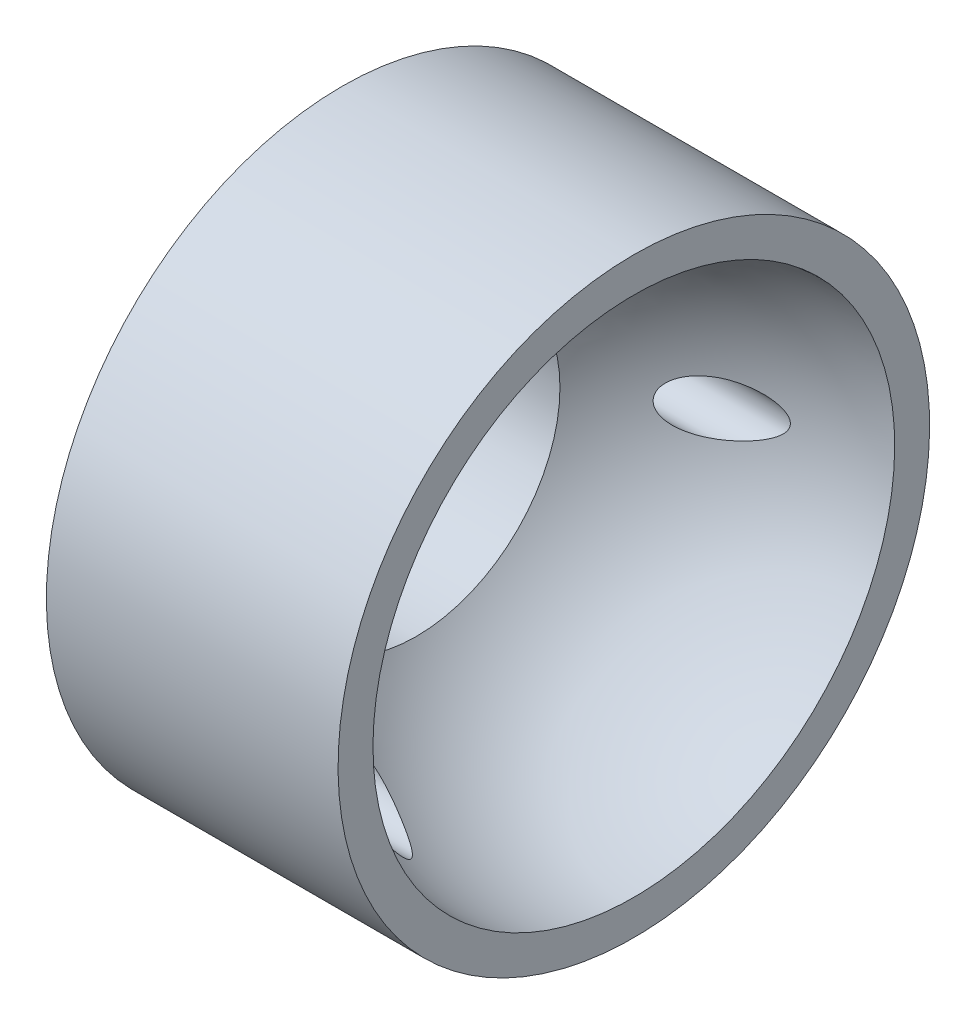
ISO-10303-21;
HEADER;
FILE_DESCRIPTION(('STEP AP214'),'2;1');
FILE_NAME('part.step','',(''),(''),'','','');
FILE_SCHEMA(('AUTOMOTIVE_DESIGN { 1 0 10303 214 1 1 1 1 }'));
ENDSEC;
DATA;
#1=APPLICATION_CONTEXT('core data for automotive mechanical design processes');
#2=APPLICATION_PROTOCOL_DEFINITION('international standard','automotive_design',2000,#1);
#3=PRODUCT_CONTEXT('',#1,'mechanical');
#4=PRODUCT('Part','Part','',(#3));
#5=PRODUCT_RELATED_PRODUCT_CATEGORY('part','',(#4));
#6=PRODUCT_DEFINITION_FORMATION('','',#4);
#7=PRODUCT_DEFINITION_CONTEXT('part definition',#1,'design');
#8=PRODUCT_DEFINITION('design','',#6,#7);
#9=PRODUCT_DEFINITION_SHAPE('','',#8);
#10=(LENGTH_UNIT() NAMED_UNIT(*) SI_UNIT(.MILLI.,.METRE.));
#11=(NAMED_UNIT(*) PLANE_ANGLE_UNIT() SI_UNIT($,.RADIAN.));
#12=(NAMED_UNIT(*) SI_UNIT($,.STERADIAN.) SOLID_ANGLE_UNIT());
#13=UNCERTAINTY_MEASURE_WITH_UNIT(LENGTH_MEASURE(1.E-05),#10,'distance_accuracy_value','');
#14=(GEOMETRIC_REPRESENTATION_CONTEXT(3) GLOBAL_UNCERTAINTY_ASSIGNED_CONTEXT((#13)) GLOBAL_UNIT_ASSIGNED_CONTEXT((#10,
#11,#12)) REPRESENTATION_CONTEXT('',''));
#15=CARTESIAN_POINT('',(0.,0.,0.));
#16=DIRECTION('',(0.,0.,1.));
#17=DIRECTION('',(1.,0.,0.));
#18=AXIS2_PLACEMENT_3D('',#15,#16,#17);
#19=CARTESIAN_POINT('',(0.,0.,0.));
#20=DIRECTION('',(-1.,0.,0.));
#21=DIRECTION('',(0.,-1.,0.));
#22=AXIS2_PLACEMENT_3D('',#19,#20,#21);
#23=PLANE('',#22);
#24=CARTESIAN_POINT('',(0.,-0.76529123861778,-10.6725971216052));
#25=DIRECTION('',(-1.,0.,0.));
#26=DIRECTION('',(0.,0.,1.));
#27=AXIS2_PLACEMENT_3D('',#24,#25,#26);
#28=CIRCLE('',#27,1.24999999999999);
#29=CARTESIAN_POINT('',(0.,-0.76529123861778,-9.42259712160518));
#30=VERTEX_POINT('',#29);
#31=EDGE_CURVE('E100',#30,#30,#28,.T.);
#32=ORIENTED_EDGE('',*,*,#31,.F.);
#33=EDGE_LOOP('',(#32));
#34=FACE_BOUND('',#33,.T.);
#35=CARTESIAN_POINT('',(0.,-8.86009461235783,5.99906021473928));
#36=DIRECTION('',(-1.,0.,0.));
#37=DIRECTION('',(0.,0.,1.));
#38=AXIS2_PLACEMENT_3D('',#35,#36,#37);
#39=CIRCLE('',#38,1.24999999999999);
#40=CARTESIAN_POINT('',(0.,-8.86009461235783,7.24906021473927));
#41=VERTEX_POINT('',#40);
#42=EDGE_CURVE('E91',#41,#41,#39,.T.);
#43=ORIENTED_EDGE('',*,*,#42,.F.);
#44=EDGE_LOOP('',(#43));
#45=FACE_BOUND('',#44,.T.);
#46=CARTESIAN_POINT('',(0.,9.62538585097562,4.67353690686597));
#47=DIRECTION('',(-1.,0.,0.));
#48=DIRECTION('',(0.,0.,1.));
#49=AXIS2_PLACEMENT_3D('',#46,#47,#48);
#50=CIRCLE('',#49,1.24999999999999);
#51=CARTESIAN_POINT('',(0.,9.62538585097562,5.92353690686596));
#52=VERTEX_POINT('',#51);
#53=EDGE_CURVE('E71',#52,#52,#50,.T.);
#54=ORIENTED_EDGE('',*,*,#53,.F.);
#55=EDGE_LOOP('',(#54));
#56=FACE_BOUND('',#55,.T.);
#57=CARTESIAN_POINT('',(0.,0.,0.));
#58=DIRECTION('',(-1.,0.,0.));
#59=DIRECTION('',(0.,-1.,0.));
#60=AXIS2_PLACEMENT_3D('',#57,#58,#59);
#61=CIRCLE('',#60,7.);
#62=CARTESIAN_POINT('',(0.,-7.,0.));
#63=VERTEX_POINT('',#62);
#64=EDGE_CURVE('E61',#63,#63,#61,.T.);
#65=ORIENTED_EDGE('',*,*,#64,.F.);
#66=EDGE_LOOP('',(#65));
#67=FACE_BOUND('',#66,.T.);
#68=CARTESIAN_POINT('',(0.,0.,0.));
#69=DIRECTION('',(1.,0.,0.));
#70=DIRECTION('',(0.,1.,0.));
#71=AXIS2_PLACEMENT_3D('',#68,#69,#70);
#72=CIRCLE('',#71,14.4);
#73=CARTESIAN_POINT('',(0.,14.4,0.));
#74=VERTEX_POINT('',#73);
#75=EDGE_CURVE('E11',#74,#74,#72,.T.);
#76=ORIENTED_EDGE('',*,*,#75,.F.);
#77=EDGE_LOOP('',(#76));
#78=FACE_BOUND('',#77,.T.);
#79=ADVANCED_FACE('F30',(#34,#45,#56,#67,#78),#23,.T.);
#80=CARTESIAN_POINT('',(14.2,0.,0.));
#81=DIRECTION('',(1.,0.,0.));
#82=DIRECTION('',(0.,1.,0.));
#83=AXIS2_PLACEMENT_3D('',#80,#81,#82);
#84=CYLINDRICAL_SURFACE('',#83,14.4);
#85=ORIENTED_EDGE('',*,*,#75,.T.);
#86=EDGE_LOOP('',(#85));
#87=FACE_BOUND('',#86,.T.);
#88=CARTESIAN_POINT('',(14.2,0.,0.));
#89=DIRECTION('',(1.,0.,0.));
#90=DIRECTION('',(0.,1.,0.));
#91=AXIS2_PLACEMENT_3D('',#88,#89,#90);
#92=CIRCLE('',#91,14.4);
#93=CARTESIAN_POINT('',(14.2,14.4,0.));
#94=VERTEX_POINT('',#93);
#95=EDGE_CURVE('E37',#94,#94,#92,.T.);
#96=ORIENTED_EDGE('',*,*,#95,.F.);
#97=EDGE_LOOP('',(#96));
#98=FACE_BOUND('',#97,.T.);
#99=ADVANCED_FACE('F113',(#87,#98),#84,.T.);
#100=CARTESIAN_POINT('',(14.2,14.4,0.));
#101=DIRECTION('',(1.,0.,0.));
#102=DIRECTION('',(0.,1.,0.));
#103=AXIS2_PLACEMENT_3D('',#100,#101,#102);
#104=PLANE('',#103);
#105=CARTESIAN_POINT('',(14.2,0.,0.));
#106=DIRECTION('',(-1.,0.,0.));
#107=DIRECTION('',(0.,-0.597609527465706,-0.801787286430895));
#108=AXIS2_PLACEMENT_3D('',#105,#106,#107);
#109=CIRCLE('',#108,12.7);
#110=CARTESIAN_POINT('',(14.2,11.3513044218063,5.69542678999738));
#111=VERTEX_POINT('',#110);
#112=CARTESIAN_POINT('',(14.2,11.3496003986611,5.6988218774332));
#113=VERTEX_POINT('',#112);
#114=EDGE_CURVE('E43',#111,#113,#109,.T.);
#115=ORIENTED_EDGE('',*,*,#114,.T.);
#116=DIRECTION('',(0.,-0.448637028120796,0.893714057738234));
#117=VECTOR('',#116,1.);
#118=CARTESIAN_POINT('',(14.2,11.3507365550642,5.69655858018929));
#119=LINE('',#118,#117);
#120=EDGE_CURVE('E45',#111,#113,#119,.T.);
#121=ORIENTED_EDGE('',*,*,#120,.F.);
#122=EDGE_LOOP('',(#115,#121));
#123=FACE_BOUND('',#122,.T.);
#124=ORIENTED_EDGE('',*,*,#95,.T.);
#125=EDGE_LOOP('',(#124));
#126=FACE_BOUND('',#125,.T.);
#127=ADVANCED_FACE('F50',(#123,#126),#104,.T.);
#128=CARTESIAN_POINT('',(14.2,0.,0.));
#129=DIRECTION('',(0.,0.893758783863327,0.448547919699944));
#130=DIRECTION('',(0.,0.448547919699944,-0.893758783863327));
#131=AXIS2_PLACEMENT_3D('',#128,#129,#130);
#132=SPHERICAL_SURFACE('',#131,12.7);
#133=CARTESIAN_POINT('',(6.10735493064374,-1.51208026542177,-9.67019650081124));
#134=CARTESIAN_POINT('',(6.0630946924696,-1.47098817732354,-9.63958207829298));
#135=CARTESIAN_POINT('',(6.02082465141927,-1.42661185456264,-9.61043518673802));
#136=CARTESIAN_POINT('',(5.94183711252324,-1.3307950672161,-9.55647950517179));
#137=CARTESIAN_POINT('',(5.90511221498297,-1.27936419473436,-9.53166492688244));
#138=CARTESIAN_POINT('',(5.8466906465947,-1.18165689897466,-9.4930856198854));
#139=CARTESIAN_POINT('',(5.82346905246986,-1.13678967573215,-9.47809077998585));
#140=CARTESIAN_POINT('',(5.78293264560382,-1.04316162109468,-9.45291205738038));
#141=CARTESIAN_POINT('',(5.76561391700085,-0.994403397526578,-9.44272498355082));
#142=CARTESIAN_POINT('',(5.73804486901545,-0.893506087269511,-9.42813751951474));
#143=CARTESIAN_POINT('',(5.72786626533449,-0.841338295454793,-9.4237954490729));
#144=CARTESIAN_POINT('',(5.71588274760859,-0.735929975353148,-9.42183474138107));
#145=CARTESIAN_POINT('',(5.71406960220954,-0.682690553361608,-9.42420949127212));
#146=CARTESIAN_POINT('',(5.71860544203707,-0.585401752465391,-9.43479072740843));
#147=CARTESIAN_POINT('',(5.72375548573905,-0.541185703963919,-9.44205576111989));
#148=CARTESIAN_POINT('',(5.73978382150846,-0.454787446615498,-9.46096877709596));
#149=CARTESIAN_POINT('',(5.75066328818278,-0.412605656754646,-9.47261765796697));
#150=CARTESIAN_POINT('',(5.77766083446641,-0.330480757843624,-9.49984597332714));
#151=CARTESIAN_POINT('',(5.79386295558245,-0.290586493075506,-9.51548750205987));
#152=CARTESIAN_POINT('',(5.83058052166809,-0.214276482752157,-9.54981650107071));
#153=CARTESIAN_POINT('',(5.85109775818151,-0.177862191168928,-9.56850523575715));
#154=CARTESIAN_POINT('',(5.90955911474236,-0.08700619381387,-9.62062999906057));
#155=CARTESIAN_POINT('',(5.95038276428266,-0.0355140830459598,-9.65598518134321));
#156=CARTESIAN_POINT('',(6.03850038620164,0.0584273042989917,-9.73047191930636));
#157=CARTESIAN_POINT('',(6.08581281734713,0.100849866421846,-9.76961415099331));
#158=CARTESIAN_POINT('',(6.21302099257909,0.199281546527893,-9.87279210572851));
#159=CARTESIAN_POINT('',(6.29620054267414,0.24938782445214,-9.93837668177117));
#160=CARTESIAN_POINT('',(6.469152404534,0.333274242638563,-10.0710789993553));
#161=CARTESIAN_POINT('',(6.55893645971275,0.367024450570988,-10.138199318154));
#162=CARTESIAN_POINT('',(6.726220114988,0.416149266080798,-10.260050224408));
#163=CARTESIAN_POINT('',(6.80304472375812,0.433730807414971,-10.3148496488916));
#164=CARTESIAN_POINT('',(6.95873923471126,0.46093497519467,-10.4235737307925));
#165=CARTESIAN_POINT('',(7.03761039368731,0.470552585666099,-10.4774978159622));
#166=CARTESIAN_POINT('',(7.19691808350159,0.482726850732206,-10.5840945949991));
#167=CARTESIAN_POINT('',(7.27735722961279,0.485270469391964,-10.6367648014496));
#168=CARTESIAN_POINT('',(7.43925027086778,0.483941956420558,-10.7404519720999));
#169=CARTESIAN_POINT('',(7.52070441696573,0.480068205582202,-10.791468515742));
#170=CARTESIAN_POINT('',(7.71347485451121,0.463973955500031,-10.9094790013145));
#171=CARTESIAN_POINT('',(7.82507493438956,0.449268211827188,-10.9756779398875));
#172=CARTESIAN_POINT('',(8.04882490027182,0.409775102844191,-11.1041512996605));
#173=CARTESIAN_POINT('',(8.16097509701501,0.384981177851241,-11.1664231368366));
#174=CARTESIAN_POINT('',(8.38506602906156,0.325572046509685,-11.2866116944696));
#175=CARTESIAN_POINT('',(8.49700666429547,0.290952970085273,-11.3445266873936));
#176=CARTESIAN_POINT('',(8.71963390741282,0.211576518116536,-11.4554719102402));
#177=CARTESIAN_POINT('',(8.83032163447174,0.166829089030157,-11.5085068611727));
#178=CARTESIAN_POINT('',(8.99264675612397,0.0917995881644549,-11.5831368608149));
#179=CARTESIAN_POINT('',(9.04535933271861,0.065923669579398,-11.6068662972995));
#180=CARTESIAN_POINT('',(9.14981910519593,0.0111319297773833,-11.652877452993));
#181=CARTESIAN_POINT('',(9.20156662028465,-0.0177828645164547,-11.6751596571711));
#182=CARTESIAN_POINT('',(9.30341493318194,-0.078959955779801,-11.7179857245559));
#183=CARTESIAN_POINT('',(9.35352249249163,-0.111205362071835,-11.7385374841516));
#184=CARTESIAN_POINT('',(9.45160793389778,-0.17980560337967,-11.777707762396));
#185=CARTESIAN_POINT('',(9.49958806381573,-0.216155949750273,-11.7963283507816));
#186=CARTESIAN_POINT('',(9.57705756499792,-0.281277494826617,-11.8254422088373));
#187=CARTESIAN_POINT('',(9.6074682034875,-0.308646777322511,-11.836603682252));
#188=CARTESIAN_POINT('',(9.66615838227156,-0.366194759959776,-11.8575706483192));
#189=CARTESIAN_POINT('',(9.69443457185625,-0.396377717648945,-11.8673740283552));
#190=CARTESIAN_POINT('',(9.7480316688288,-0.460314562342887,-11.8852819806901));
#191=CARTESIAN_POINT('',(9.77332070513372,-0.494100709934435,-11.8933688588204));
#192=CARTESIAN_POINT('',(9.81884507263101,-0.565401925628212,-11.9070410228096));
#193=CARTESIAN_POINT('',(9.83909487783535,-0.602905870963653,-11.9126335107569));
#194=CARTESIAN_POINT('',(9.86642134714888,-0.668088332486282,-11.9190835003376));
#195=CARTESIAN_POINT('',(9.87563568491244,-0.694763849147675,-11.9209048904817));
#196=CARTESIAN_POINT('',(9.88995553382561,-0.749254230458148,-11.9227902259383));
#197=CARTESIAN_POINT('',(9.89506674434809,-0.7770674581182,-11.9228566131152));
#198=CARTESIAN_POINT('',(9.9006197696284,-0.833269011040459,-11.9210651681729));
#199=CARTESIAN_POINT('',(9.90103546590812,-0.861659673961382,-11.9191966358996));
#200=CARTESIAN_POINT('',(9.89707631499576,-0.917917362252097,-11.9135670459598));
#201=CARTESIAN_POINT('',(9.89269834589047,-0.945784034339904,-11.9098047558309));
#202=CARTESIAN_POINT('',(9.87861339486928,-1.0046085012793,-11.8998934530438));
#203=CARTESIAN_POINT('',(9.86815719347141,-1.03533448636369,-11.8934562856666));
#204=CARTESIAN_POINT('',(9.84274466366481,-1.09442036152839,-11.8788746427545));
#205=CARTESIAN_POINT('',(9.82777937584826,-1.12277539596842,-11.8707267779828));
#206=CARTESIAN_POINT('',(9.78437456149773,-1.19371505439576,-11.8477900546769));
#207=CARTESIAN_POINT('',(9.75330532898623,-1.23434010010346,-11.8319964518534));
#208=CARTESIAN_POINT('',(9.68612093673151,-1.31016992242403,-11.7983566388478));
#209=CARTESIAN_POINT('',(9.64999094963203,-1.34535810850285,-11.7805044253961));
#210=CARTESIAN_POINT('',(9.57301772340145,-1.41273012988272,-11.7425860263139));
#211=CARTESIAN_POINT('',(9.53203914596798,-1.44472167650821,-11.7224578716723));
#212=CARTESIAN_POINT('',(9.44788432568092,-1.5048457587128,-11.6810079006065));
#213=CARTESIAN_POINT('',(9.40470579527127,-1.53297416021449,-11.6596848392952));
#214=CARTESIAN_POINT('',(9.31681417747836,-1.58603454311074,-11.6160280193418));
#215=CARTESIAN_POINT('',(9.27209853689272,-1.61096084471754,-11.593692557307));
#216=CARTESIAN_POINT('',(9.18163251340917,-1.65801249554921,-11.5481644832981));
#217=CARTESIAN_POINT('',(9.1358817610263,-1.68013682540307,-11.5249715633182));
#218=CARTESIAN_POINT('',(8.99373263982176,-1.74452539400932,-11.4522892504534));
#219=CARTESIAN_POINT('',(8.89611415242367,-1.78266857611793,-11.4015090185579));
#220=CARTESIAN_POINT('',(8.69927641171313,-1.84991102317041,-11.2970543815023));
#221=CARTESIAN_POINT('',(8.60005574693922,-1.87900179815423,-11.2433773145141));
#222=CARTESIAN_POINT('',(8.40073927079018,-1.92884108510125,-11.133361911347));
#223=CARTESIAN_POINT('',(8.30064214439252,-1.94957346398399,-11.0770186608812));
#224=CARTESIAN_POINT('',(8.10038350048046,-1.98278297230922,-10.962064516605));
#225=CARTESIAN_POINT('',(8.00022198137552,-1.99525988932471,-10.9034535644839));
#226=CARTESIAN_POINT('',(7.79439250905551,-2.01223430466963,-10.7807410087401));
#227=CARTESIAN_POINT('',(7.68875168850061,-2.01621260734486,-10.7165202478349));
#228=CARTESIAN_POINT('',(7.47853848667066,-2.01401174014564,-10.5863594265118));
#229=CARTESIAN_POINT('',(7.37396672744811,-2.0078269614066,-10.5204184364908));
#230=CARTESIAN_POINT('',(7.16698662352134,-1.98425490360655,-10.3877165481175));
#231=CARTESIAN_POINT('',(7.06457296739319,-1.96689956661499,-10.320958518355));
#232=CARTESIAN_POINT('',(6.86279784423406,-1.91951631948214,-10.1875464488851));
#233=CARTESIAN_POINT('',(6.76343256752292,-1.88950498111013,-10.1208923871862));
#234=CARTESIAN_POINT('',(6.56586280866749,-1.81335847338638,-9.98688418288783));
#235=CARTESIAN_POINT('',(6.46780794929011,-1.76671823974289,-9.9195810162606));
#236=CARTESIAN_POINT('',(6.32694263506689,-1.68254567971058,-9.82232402990582));
#237=CARTESIAN_POINT('',(6.28108091093808,-1.65216955196049,-9.79056136072476));
#238=CARTESIAN_POINT('',(6.19201727173345,-1.58617974748104,-9.72883648696676));
#239=CARTESIAN_POINT('',(6.14881301509846,-1.55057077810483,-9.6988726979275));
#240=CARTESIAN_POINT('',(6.10735493064374,-1.51208026542177,-9.67019650081124));
#241=B_SPLINE_CURVE_WITH_KNOTS('',3,(#133,#134,#135,#136,#137,#138,#139,#140,#141,#142,#143,
#144,#145,#146,#147,#148,#149,#150,#151,#152,#153,#154,#155,#156,#157,#158,#159,#160,#161,#162,
#163,#164,#165,#166,#167,#168,#169,#170,#171,#172,#173,#174,#175,#176,#177,#178,#179,#180,#181,
#182,#183,#184,#185,#186,#187,#188,#189,#190,#191,#192,#193,#194,#195,#196,#197,#198,#199,#200,
#201,#202,#203,#204,#205,#206,#207,#208,#209,#210,#211,#212,#213,#214,#215,#216,#217,#218,#219,
#220,#221,#222,#223,#224,#225,#226,#227,#228,#229,#230,#231,#232,#233,#234,#235,#236,#237,#238,
#239,#240),.UNSPECIFIED.,.T.,.F.,(4,2,2,2,2,2,2,2,2,2,2,2,2,2,2,2,2,2,2,2,2,2,2,2,2,2,2,2,2,2,2,
2,2,2,2,2,2,2,2,2,2,2,2,2,2,2,2,2,2,2,2,2,2,4),(0.,0.203011291502125,0.405749234520346,
0.563264803637133,0.720675675262431,0.879645786197979,1.03845944201803,1.17312948710652,
1.3078271520757,1.44476296565313,1.58175574468755,1.80433110492452,2.02755329621389,
2.37713550622005,2.72735507365135,3.01493584785747,3.30269761344852,3.590989315452,
3.87935376924241,4.27062098226022,4.66214301830808,5.05381948739024,5.44511297023126,
5.63504288816742,5.82490882846969,6.01385521998659,6.20259696838316,6.3296972604104,
6.45699309816571,6.58554345685475,6.71372020872854,6.79824999250569,6.88266215759932,
6.96754362989295,7.05248041482619,7.15119466103082,7.25010635739555,7.40978254232581,
7.5699367437341,7.73692538821251,7.90409136298783,8.07154987361889,8.23906913253009,
8.58791036652748,8.93707778819523,9.28691597044301,9.63676315426932,10.0074354435779,
10.3783123705283,10.7481334629831,11.1174718079197,11.4991462572412,11.6894749086251,
11.8796333807789),.UNSPECIFIED.);
#242=CARTESIAN_POINT('',(6.10735493064374,-1.51208026542177,-9.67019650081124));
#243=VERTEX_POINT('',#242);
#244=EDGE_CURVE('E94',#243,#243,#241,.T.);
#245=ORIENTED_EDGE('',*,*,#244,.T.);
#246=EDGE_LOOP('',(#245));
#247=FACE_BOUND('',#246,.T.);
#248=CARTESIAN_POINT('',(5.72408493451924,-7.90391257424088,5.19394164565882));
#249=CARTESIAN_POINT('',(5.73146228953573,-7.93989780631034,5.15121861281511));
#250=CARTESIAN_POINT('',(5.74351895360475,-7.97844505754778,5.11131223424886));
#251=CARTESIAN_POINT('',(5.77575551016148,-8.05859274143698,5.03829486142953));
#252=CARTESIAN_POINT('',(5.79597155957401,-8.10020608099467,5.00521511754254));
#253=CARTESIAN_POINT('',(5.8425474178319,-8.18408705538398,4.94639538533281));
#254=CARTESIAN_POINT('',(5.86882385184001,-8.22633912842895,4.9205654837659));
#255=CARTESIAN_POINT('',(5.92618069263785,-8.31081090672894,4.87518842751388));
#256=CARTESIAN_POINT('',(5.95725810053408,-8.35303061576732,4.85563737410495));
#257=CARTESIAN_POINT('',(6.04527944555736,-8.4649880387993,4.81074128214732));
#258=CARTESIAN_POINT('',(6.10554363536843,-8.53410070143482,4.7903676253602));
#259=CARTESIAN_POINT('',(6.23273877708255,-8.66868359895883,4.76188031522345));
#260=CARTESIAN_POINT('',(6.2996905566938,-8.73414139803096,4.75380632186441));
#261=CARTESIAN_POINT('',(6.42509726991068,-8.84888252279174,4.74805123482614));
#262=CARTESIAN_POINT('',(6.48281783783809,-8.89891046201205,4.74871705859629));
#263=CARTESIAN_POINT('',(6.60044278680962,-8.99597903794948,4.75551487776554));
#264=CARTESIAN_POINT('',(6.66034850175452,-9.04301780024121,4.76165026743219));
#265=CARTESIAN_POINT('',(6.7818426802859,-9.13410802311469,4.77858307229519));
#266=CARTESIAN_POINT('',(6.84343308567957,-9.17815581352018,4.78938609958522));
#267=CARTESIAN_POINT('',(6.96785608810646,-9.26323510940836,4.81502003825641));
#268=CARTESIAN_POINT('',(7.03068907080046,-9.30426565917209,4.82985221895878));
#269=CARTESIAN_POINT('',(7.19306419394755,-9.40567919043009,4.87240795426449));
#270=CARTESIAN_POINT('',(7.29329467359033,-9.46390267007487,4.90268095527368));
#271=CARTESIAN_POINT('',(7.49525766208449,-9.57318483390271,4.97040325768251));
#272=CARTESIAN_POINT('',(7.59699106284701,-9.62423905783007,5.00785699251118));
#273=CARTESIAN_POINT('',(7.80138404619572,-9.7192708237037,5.08899279675579));
#274=CARTESIAN_POINT('',(7.90404435844022,-9.76324216185483,5.13268026373239));
#275=CARTESIAN_POINT('',(8.10961265068351,-9.84400492694665,5.22561925541793));
#276=CARTESIAN_POINT('',(8.21252051223713,-9.88079928259677,5.27486849752576));
#277=CARTESIAN_POINT('',(8.39657134886921,-9.94010199541601,5.36782764889631));
#278=CARTESIAN_POINT('',(8.47777363107977,-9.96398919631268,5.41054796400048));
#279=CARTESIAN_POINT('',(8.6396239576873,-10.0069213013252,5.49933822874665));
#280=CARTESIAN_POINT('',(8.72027207961056,-10.0259668967708,5.54540769895553));
#281=CARTESIAN_POINT('',(8.88053375538676,-10.0588225728262,5.64113052116067));
#282=CARTESIAN_POINT('',(8.96014708694519,-10.0726315458821,5.69078462867282));
#283=CARTESIAN_POINT('',(9.11750694937457,-10.0943159410319,5.79413604531789));
#284=CARTESIAN_POINT('',(9.19525510929332,-10.1021967381394,5.84782964317108));
#285=CARTESIAN_POINT('',(9.3095398757272,-10.1086249206042,5.93223086508537));
#286=CARTESIAN_POINT('',(9.34731375916316,-10.1098660486303,5.96106572333283));
#287=CARTESIAN_POINT('',(9.42170748980347,-10.1102662939692,6.02019031896028));
#288=CARTESIAN_POINT('',(9.45832781339077,-10.1094262824503,6.05047944237759));
#289=CARTESIAN_POINT('',(9.52978723186343,-10.1053142056041,6.11260769241378));
#290=CARTESIAN_POINT('',(9.56463422824368,-10.1020541680611,6.14443842820347));
#291=CARTESIAN_POINT('',(9.63198272901188,-10.0926043493888,6.21005500301629));
#292=CARTESIAN_POINT('',(9.66448734139222,-10.0864185359945,6.24383814002664));
#293=CARTESIAN_POINT('',(9.71823658089776,-10.0723955383739,6.30491032197852));
#294=CARTESIAN_POINT('',(9.74025659389787,-10.0653654180314,6.33169471887124));
#295=CARTESIAN_POINT('',(9.78154790807796,-10.0488233418703,6.38667998980875));
#296=CARTESIAN_POINT('',(9.80081615421492,-10.0393086602928,6.41488239190643));
#297=CARTESIAN_POINT('',(9.83563877207864,-10.0171940904862,6.4729791591099));
#298=CARTESIAN_POINT('',(9.85114126761519,-10.0045554741221,6.5028908305371));
#299=CARTESIAN_POINT('',(9.87643489687928,-9.97590281014136,6.56349166896497));
#300=CARTESIAN_POINT('',(9.88624454089688,-9.95989993526898,6.59417797372934));
#301=CARTESIAN_POINT('',(9.89710692749445,-9.92907746499022,6.64749961343027));
#302=CARTESIAN_POINT('',(9.89973913402279,-9.9149681687653,6.67022343422371));
#303=CARTESIAN_POINT('',(9.90068463355627,-9.88526234100899,6.71477415383599));
#304=CARTESIAN_POINT('',(9.89899873090932,-9.86966608697896,6.73660121892684));
#305=CARTESIAN_POINT('',(9.89151247435435,-9.83754478651407,6.77866948821947));
#306=CARTESIAN_POINT('',(9.8857266473237,-9.82102320849202,6.79891601222947));
#307=CARTESIAN_POINT('',(9.87062605707395,-9.78747681690147,6.83758237220764));
#308=CARTESIAN_POINT('',(9.86130824824229,-9.7704515807452,6.85600061431096));
#309=CARTESIAN_POINT('',(9.83341372632553,-9.72603392377169,6.9013770404843));
#310=CARTESIAN_POINT('',(9.81263201665341,-9.69852885296901,6.92685751645355));
#311=CARTESIAN_POINT('',(9.76625856826114,-9.64388385630684,6.97346979391276));
#312=CARTESIAN_POINT('',(9.74065120488941,-9.6167454323674,6.99458698868604));
#313=CARTESIAN_POINT('',(9.68765270773249,-9.56444062162427,7.03220079698081));
#314=CARTESIAN_POINT('',(9.66041526938048,-9.53924356272099,7.04887592822551));
#315=CARTESIAN_POINT('',(9.60394628759392,-9.4894049071147,7.07948730557198));
#316=CARTESIAN_POINT('',(9.57471287795362,-9.46476385971918,7.09342093983593));
#317=CARTESIAN_POINT('',(9.48482692308895,-9.39154304906457,7.13180845946478));
#318=CARTESIAN_POINT('',(9.42206945944849,-9.34374130870111,7.15279717850587));
#319=CARTESIAN_POINT('',(9.28630559938863,-9.24450102384691,7.18978767639925));
#320=CARTESIAN_POINT('',(9.21294272367332,-9.19326244708759,7.20495718472512));
#321=CARTESIAN_POINT('',(9.06401361283203,-9.09231811944864,7.22839067144203));
#322=CARTESIAN_POINT('',(8.98844508042905,-9.04261408637327,7.23664716324337));
#323=CARTESIAN_POINT('',(8.8358900366883,-8.94443041727972,7.24719011682198));
#324=CARTESIAN_POINT('',(8.75890073734299,-8.89595376112717,7.24946321487412));
#325=CARTESIAN_POINT('',(8.60419336667787,-8.80021975350269,7.24854186167485));
#326=CARTESIAN_POINT('',(8.52647514370021,-8.75296266380365,7.24534624634248));
#327=CARTESIAN_POINT('',(8.33796147711186,-8.64006424925022,7.23135397390211));
#328=CARTESIAN_POINT('',(8.22698442263583,-8.57503857453841,7.217928383192));
#329=CARTESIAN_POINT('',(8.00507860746039,-8.44771036175017,7.18093714830477));
#330=CARTESIAN_POINT('',(7.89414991552976,-8.38540947850589,7.15736543381658));
#331=CARTESIAN_POINT('',(7.67339052341823,-8.26437288346543,7.10000911605217));
#332=CARTESIAN_POINT('',(7.56355762289884,-8.2056277069652,7.0662531993254));
#333=CARTESIAN_POINT('',(7.3455145113635,-8.09256652746176,6.98806037548185));
#334=CARTESIAN_POINT('',(7.23730299593979,-8.03824678860729,6.9436326050756));
#335=CARTESIAN_POINT('',(7.01972673885689,-7.93372677800227,6.84159397972457));
#336=CARTESIAN_POINT('',(6.91044834988726,-7.88372995291823,6.78358549018423));
#337=CARTESIAN_POINT('',(6.69616379658007,-7.7925171463307,6.65408368254929));
#338=CARTESIAN_POINT('',(6.5911551792094,-7.75129606370694,6.58259824408885));
#339=CARTESIAN_POINT('',(6.41228269937314,-7.68988541966776,6.44340540498558));
#340=CARTESIAN_POINT('',(6.3369316524506,-7.66702706618463,6.37881123373134));
#341=CARTESIAN_POINT('',(6.19257598648221,-7.63151660155523,6.24030260479407));
#342=CARTESIAN_POINT('',(6.12355825822064,-7.61884296690246,6.16640818599791));
#343=CARTESIAN_POINT('',(6.01926978047532,-7.6097297634357,6.03835818105787));
#344=CARTESIAN_POINT('',(5.98095354206293,-7.60902163915456,5.98699996437986));
#345=CARTESIAN_POINT('',(5.90981297692887,-7.61455975537132,5.88093074989985));
#346=CARTESIAN_POINT('',(5.87698062879593,-7.62079573428895,5.82622481192469));
#347=CARTESIAN_POINT('',(5.82465647180957,-7.63949600687396,5.72575933698004));
#348=CARTESIAN_POINT('',(5.80380953432082,-7.65044316696011,5.68043171946653));
#349=CARTESIAN_POINT('',(5.76802878145507,-7.67824245359917,5.58918990162065));
#350=CARTESIAN_POINT('',(5.75309389862331,-7.69509351313311,5.54327580872651));
#351=CARTESIAN_POINT('',(5.73018218784854,-7.73510363782578,5.45188076938419));
#352=CARTESIAN_POINT('',(5.72227197992497,-7.75832042208483,5.40640793262619));
#353=CARTESIAN_POINT('',(5.71444887268091,-7.81051788497913,5.31825683629596));
#354=CARTESIAN_POINT('',(5.71451268900188,-7.83948153533726,5.27557080438512));
#355=CARTESIAN_POINT('',(5.71990176872406,-7.88149766412283,5.22113469288091));
#356=CARTESIAN_POINT('',(5.72176123228637,-7.89257802901115,5.20739844780431));
#357=CARTESIAN_POINT('',(5.72408493451924,-7.90391257424088,5.19394164565882));
#358=B_SPLINE_CURVE_WITH_KNOTS('',3,(#248,#249,#250,#251,#252,#253,#254,#255,#256,#257,#258,
#259,#260,#261,#262,#263,#264,#265,#266,#267,#268,#269,#270,#271,#272,#273,#274,#275,#276,#277,
#278,#279,#280,#281,#282,#283,#284,#285,#286,#287,#288,#289,#290,#291,#292,#293,#294,#295,#296,
#297,#298,#299,#300,#301,#302,#303,#304,#305,#306,#307,#308,#309,#310,#311,#312,#313,#314,#315,
#316,#317,#318,#319,#320,#321,#322,#323,#324,#325,#326,#327,#328,#329,#330,#331,#332,#333,#334,
#335,#336,#337,#338,#339,#340,#341,#342,#343,#344,#345,#346,#347,#348,#349,#350,#351,#352,#353,
#354,#355,#356,#357),.UNSPECIFIED.,.T.,.F.,(4,2,2,2,2,2,2,2,2,2,2,2,2,2,2,2,2,2,2,2,2,2,2,2,2,2,
2,2,2,2,2,2,2,2,2,2,2,2,2,2,2,2,2,2,2,2,2,2,2,2,2,2,2,2,4),(0.,0.168967264480329,
0.338691646573967,0.506207335383335,0.67361880669644,0.953824509458064,1.2349318309457,
1.46377863507469,1.69276755439823,1.92203256608554,2.15136988802838,2.51024584308051,
2.86934408806123,3.22875517142492,3.58801928175062,3.87229138065908,4.15652286571099,
4.4408144326844,4.72484792381118,4.86739964110693,5.0098916961165,5.1516802526518,
5.29327707426497,5.39924810111354,5.5053358785371,5.61281133887029,5.71993535629517,
5.80018524253381,5.88042018145843,5.96037224383969,6.04039340595062,6.16825628322557,
6.29654050242928,6.41839609571404,6.54036722519746,6.78467271539607,7.05660333589094,
7.32882806958166,7.60166029493382,7.87455060310725,8.26206608586591,8.64981373771538,
9.03647923232196,9.42281485572629,9.82231510608113,10.2215824990033,10.5263116423121,
10.8303950911928,11.0221018770625,11.2135257456141,11.3661822193457,11.518811117506,
11.672872506117,11.8264840420027,11.8797049604589),.UNSPECIFIED.);
#359=CARTESIAN_POINT('',(5.72408493451924,-7.90391257424088,5.19394164565882));
#360=VERTEX_POINT('',#359);
#361=EDGE_CURVE('E86',#360,#360,#358,.T.);
#362=ORIENTED_EDGE('',*,*,#361,.T.);
#363=EDGE_LOOP('',(#362));
#364=FACE_BOUND('',#363,.T.);
#365=CARTESIAN_POINT('',(5.74075584983461,8.61629810290551,3.93580937099571));
#366=CARTESIAN_POINT('',(5.73049074937436,8.58944306158267,3.97253854719901));
#367=CARTESIAN_POINT('',(5.72320749294696,8.56421348235158,4.01128582942572));
#368=CARTESIAN_POINT('',(5.71515865916084,8.5179961451575,4.09186735370229));
#369=CARTESIAN_POINT('',(5.71438959883858,8.49700612627815,4.13369993405615));
#370=CARTESIAN_POINT('',(5.71943411829152,8.45999266285176,4.21908728961559));
#371=CARTESIAN_POINT('',(5.72524399904176,8.44396643385159,4.26264108378238));
#372=CARTESIAN_POINT('',(5.74296318327981,8.41708770904917,4.35009629790262));
#373=CARTESIAN_POINT('',(5.75487684626379,8.40623892183575,4.39399794420733));
#374=CARTESIAN_POINT('',(5.78711771052516,8.38772106567579,4.49029488597218));
#375=CARTESIAN_POINT('',(5.8087014066392,8.38123306292177,4.54249232663542));
#376=CARTESIAN_POINT('',(5.85802993600812,8.37468243423193,4.6442925261476));
#377=CARTESIAN_POINT('',(5.88578429332765,8.37462981088271,4.69389112600314));
#378=CARTESIAN_POINT('',(5.95894490487683,8.38100667844174,4.81043642398813));
#379=CARTESIAN_POINT('',(6.00680966380543,8.39023324035489,4.87567189990624));
#380=CARTESIAN_POINT('',(6.10902696993036,8.4168366156479,4.9989636097595));
#381=CARTESIAN_POINT('',(6.16339263636318,8.43423012460192,5.05700482792339));
#382=CARTESIAN_POINT('',(6.26524550016849,8.47098321418524,5.15522435876664));
#383=CARTESIAN_POINT('',(6.31193987005964,8.48925750706511,5.19665579572384));
#384=CARTESIAN_POINT('',(6.40750794496679,8.52890062982457,5.27533431176147));
#385=CARTESIAN_POINT('',(6.45638292185938,8.5502712824805,5.31257890301864));
#386=CARTESIAN_POINT('',(6.60562075421458,8.61812507838523,5.41850939813671));
#387=CARTESIAN_POINT('',(6.7085074046723,8.66831609406894,5.48130913805952));
#388=CARTESIAN_POINT('',(6.89855730933374,8.7650338404499,5.58250373924152));
#389=CARTESIAN_POINT('',(6.98505811661354,8.81048742479394,5.62326646239773));
#390=CARTESIAN_POINT('',(7.159973086887,8.90447796688273,5.69644492017825));
#391=CARTESIAN_POINT('',(7.24838841967139,8.95301684694683,5.72885538603056));
#392=CARTESIAN_POINT('',(7.42658997023191,9.05235608620901,5.78593194944543));
#393=CARTESIAN_POINT('',(7.51637799865909,9.10315963917748,5.81058668787214));
#394=CARTESIAN_POINT('',(7.69672705951918,9.20633943698573,5.85251947546777));
#395=CARTESIAN_POINT('',(7.78728790004516,9.25871529907737,5.86979930457731));
#396=CARTESIAN_POINT('',(7.97368255231536,9.36745016115477,5.8979925318327));
#397=CARTESIAN_POINT('',(8.06953861943641,9.42387211062229,5.90851467801954));
#398=CARTESIAN_POINT('',(8.26125097512033,9.5376306075287,5.92176743492376));
#399=CARTESIAN_POINT('',(8.35710726361341,9.59496718067857,5.92449782621764));
#400=CARTESIAN_POINT('',(8.54824713637159,9.71031832733035,5.92198156577353));
#401=CARTESIAN_POINT('',(8.6435309719164,9.76833256451755,5.91673871697068));
#402=CARTESIAN_POINT('',(8.83282021451798,9.88497713337929,5.89771491127894));
#403=CARTESIAN_POINT('',(8.92682650264041,9.94360698525643,5.88394017942506));
#404=CARTESIAN_POINT('',(9.07140427019239,10.0355554617482,5.85482826361479));
#405=CARTESIAN_POINT('',(9.12282542792999,10.0686188099563,5.842866900208));
#406=CARTESIAN_POINT('',(9.22454398103664,10.1350276939477,5.81549002333828));
#407=CARTESIAN_POINT('',(9.27484178485432,10.168373120881,5.80007578857913));
#408=CARTESIAN_POINT('',(9.37381027958058,10.2354270045351,5.76522377010783));
#409=CARTESIAN_POINT('',(9.42248068429853,10.2691355237449,5.74578528297751));
#410=CARTESIAN_POINT('',(9.51724799547541,10.3369491755457,5.70203284685557));
#411=CARTESIAN_POINT('',(9.56334820646569,10.3710537273989,5.6777253518628));
#412=CARTESIAN_POINT('',(9.6519145248531,10.440058919256,5.62263713472723));
#413=CARTESIAN_POINT('',(9.69433721507835,10.4749641611719,5.59179089499863));
#414=CARTESIAN_POINT('',(9.7715934567848,10.5447743739343,5.52184927905515));
#415=CARTESIAN_POINT('',(9.80648533566138,10.5796770863233,5.48282228694574));
#416=CARTESIAN_POINT('',(9.84753417727791,10.6296259836291,5.41829654324086));
#417=CARTESIAN_POINT('',(9.85907253610293,10.6452955172112,5.39674660145708));
#418=CARTESIAN_POINT('',(9.87829586195319,10.6759156123933,5.3514983579285));
#419=CARTESIAN_POINT('',(9.88598400813981,10.69086675792,5.32780184778562));
#420=CARTESIAN_POINT('',(9.89674351751894,10.7196569907903,5.27842688671591));
#421=CARTESIAN_POINT('',(9.89977506043281,10.7334855390431,5.25273329399681));
#422=CARTESIAN_POINT('',(9.90068422948933,10.7593220459821,5.2003581955558));
#423=CARTESIAN_POINT('',(9.89856275049039,10.7713303203869,5.17367686215439));
#424=CARTESIAN_POINT('',(9.88987776761508,10.7921890715929,5.12271481489752));
#425=CARTESIAN_POINT('',(9.88373438648477,10.8012271297668,5.09843574681829));
#426=CARTESIAN_POINT('',(9.86802301814413,10.817493139647,5.05039836976214));
#427=CARTESIAN_POINT('',(9.85845291713501,10.8247199693951,5.02664039184495));
#428=CARTESIAN_POINT('',(9.82958472038069,10.841560555801,4.96507040646044));
#429=CARTESIAN_POINT('',(9.80797570260197,10.8497552963525,4.92796303627077));
#430=CARTESIAN_POINT('',(9.75992026653605,10.8624864035838,4.85633554977766));
#431=CARTESIAN_POINT('',(9.73345766390978,10.8670102473728,4.82182465121529));
#432=CARTESIAN_POINT('',(9.67855243965627,10.873032449604,4.75661909191816));
#433=CARTESIAN_POINT('',(9.65023757834368,10.874648583577,4.72582549044802));
#434=CARTESIAN_POINT('',(9.59159270907522,10.8757196577605,4.66616092885582));
#435=CARTESIAN_POINT('',(9.56126078701092,10.875172515485,4.63729184857256));
#436=CARTESIAN_POINT('',(9.46805566935873,10.8708449770953,4.55307107418769));
#437=CARTESIAN_POINT('',(9.40306626769135,10.8643714159803,4.50020931598861));
#438=CARTESIAN_POINT('',(9.26266664124042,10.8450350883065,4.39393506635744));
#439=CARTESIAN_POINT('',(9.18690470193569,10.8315377076845,4.34112451066238));
#440=CARTESIAN_POINT('',(9.03320281106901,10.799148303964,4.24043779605289));
#441=CARTESIAN_POINT('',(8.95526057604168,10.7802504182214,4.19256707698236));
#442=CARTESIAN_POINT('',(8.79807509393965,10.7377417137765,4.10107827753673));
#443=CARTESIAN_POINT('',(8.71883047717637,10.7141255974542,4.057465060162));
#444=CARTESIAN_POINT('',(8.55965744825691,10.6626007200144,3.9741936190242));
#445=CARTESIAN_POINT('',(8.47972893727423,10.6346913282523,3.93453597771363));
#446=CARTESIAN_POINT('',(8.30937742271901,10.5710175623301,3.85425086903829));
#447=CARTESIAN_POINT('',(8.21891392911694,10.5347055139488,3.81414278620958));
#448=CARTESIAN_POINT('',(8.03801789447607,10.4571460829055,3.73887394927256));
#449=CARTESIAN_POINT('',(7.94758536671247,10.4158974762384,3.70371442686732));
#450=CARTESIAN_POINT('',(7.76726498665974,10.3286421072978,3.63870043265337));
#451=CARTESIAN_POINT('',(7.6773765526561,10.2826420276033,3.60883866646202));
#452=CARTESIAN_POINT('',(7.49845958456244,10.1859285778608,3.55489691606728));
#453=CARTESIAN_POINT('',(7.40943079178794,10.1352166777986,3.53081513697855));
#454=CARTESIAN_POINT('',(7.19206181262947,10.00473826893,3.47958452666371));
#455=CARTESIAN_POINT('',(7.06438845780061,9.9223008034724,3.45608086344727));
#456=CARTESIAN_POINT('',(6.87649505566679,9.7913763153932,3.43382031425589));
#457=CARTESIAN_POINT('',(6.81446584880784,9.74652275775347,3.42856597290233));
#458=CARTESIAN_POINT('',(6.69197459662179,9.65444633615603,3.42302377097652));
#459=CARTESIAN_POINT('',(6.63151199465906,9.60722433174474,3.4227341215339));
#460=CARTESIAN_POINT('',(6.49109955582377,9.49299710628437,3.42881415945065));
#461=CARTESIAN_POINT('',(6.4120179532959,9.42501813692586,3.43763230032283));
#462=CARTESIAN_POINT('',(6.25970033385629,9.28558165501872,3.46849613795437));
#463=CARTESIAN_POINT('',(6.18645275779643,9.21413149661927,3.49051490202717));
#464=CARTESIAN_POINT('',(6.07241219223785,9.093874091003,3.54098020015665));
#465=CARTESIAN_POINT('',(6.02902198291118,9.04558280756227,3.56473322624632));
#466=CARTESIAN_POINT('',(5.94784785426507,8.94910875907875,3.62079884498232));
#467=CARTESIAN_POINT('',(5.91006204834806,8.90092596291963,3.65310854696562));
#468=CARTESIAN_POINT('',(5.84595517592087,8.81135350114802,3.72341138023694));
#469=CARTESIAN_POINT('',(5.81884320262284,8.76978534968809,3.760438289146));
#470=CARTESIAN_POINT('',(5.77302495372933,8.6899738512908,3.84242385256347));
#471=CARTESIAN_POINT('',(5.75429626668604,8.65172186280751,3.88736090638222));
#472=CARTESIAN_POINT('',(5.74075584983461,8.61629810290551,3.93580937099571));
#473=B_SPLINE_CURVE_WITH_KNOTS('',3,(#365,#366,#367,#368,#369,#370,#371,#372,#373,#374,#375,
#376,#377,#378,#379,#380,#381,#382,#383,#384,#385,#386,#387,#388,#389,#390,#391,#392,#393,#394,
#395,#396,#397,#398,#399,#400,#401,#402,#403,#404,#405,#406,#407,#408,#409,#410,#411,#412,#413,
#414,#415,#416,#417,#418,#419,#420,#421,#422,#423,#424,#425,#426,#427,#428,#429,#430,#431,#432,
#433,#434,#435,#436,#437,#438,#439,#440,#441,#442,#443,#444,#445,#446,#447,#448,#449,#450,#451,
#452,#453,#454,#455,#456,#457,#458,#459,#460,#461,#462,#463,#464,#465,#466,#467,#468,#469,#470,
#471,#472),.UNSPECIFIED.,.T.,.F.,(4,2,2,2,2,2,2,2,2,2,2,2,2,2,2,2,2,2,2,2,2,2,2,2,2,2,2,2,2,2,2,
2,2,2,2,2,2,2,2,2,2,2,2,2,2,2,2,2,2,2,2,2,2,4),(0.,0.139731654749225,0.279388594062906,
0.418967049908674,0.55864533595219,0.728282139694133,0.89818260858805,1.14114110726722,
1.38459845952517,1.57946446607218,1.77444565668253,2.16478283551424,2.48204335780023,
2.79950352719625,3.11742651099145,3.43527272035342,3.77016967822995,4.10507606704232,
4.43982276821587,4.77432551864214,4.96112102781364,5.14784747492815,5.33460658844339,
5.52111976675186,5.7095984851357,5.89656038854444,5.98339233837373,6.07015247143698,
6.15765047050374,6.24513327601557,6.32468540086685,6.40428668284445,6.53467635211672,
6.66550898425983,6.79091161393546,6.91643499230692,7.16789602309735,7.44753226764425,
7.72747323856565,8.00773031120186,8.2880285905268,8.60401436259733,8.92007864537162,
9.23570430929214,9.55123183337945,10.0112441721363,10.2412567927157,10.4711865337484,
10.7843447076733,11.0968661219661,11.3036759874677,11.5104160762553,11.695229394343,
11.8795456472595),.UNSPECIFIED.);
#474=CARTESIAN_POINT('',(5.74075584983461,8.61629810290551,3.93580937099571));
#475=VERTEX_POINT('',#474);
#476=EDGE_CURVE('E64',#475,#475,#473,.T.);
#477=ORIENTED_EDGE('',*,*,#476,.T.);
#478=EDGE_LOOP('',(#477));
#479=FACE_BOUND('',#478,.T.);
#480=CARTESIAN_POINT('',(3.60330240121952,0.,0.));
#481=DIRECTION('',(1.,0.,0.));
#482=DIRECTION('',(0.,1.,0.));
#483=AXIS2_PLACEMENT_3D('',#480,#481,#482);
#484=CIRCLE('',#483,7.);
#485=CARTESIAN_POINT('',(3.60330240121952,7.,0.));
#486=VERTEX_POINT('',#485);
#487=EDGE_CURVE('E48',#486,#486,#484,.T.);
#488=ORIENTED_EDGE('',*,*,#487,.F.);
#489=EDGE_LOOP('',(#488));
#490=FACE_BOUND('',#489,.T.);
#491=ORIENTED_EDGE('',*,*,#120,.T.);
#492=ORIENTED_EDGE('',*,*,#114,.F.);
#493=EDGE_LOOP('',(#491,#492));
#494=FACE_BOUND('',#493,.T.);
#495=ADVANCED_FACE('F46',(#247,#364,#479,#490,#494),#132,.F.);
#496=CARTESIAN_POINT('',(14.2073563143567,0.,0.));
#497=DIRECTION('',(-1.,0.,0.));
#498=DIRECTION('',(0.,-1.,0.));
#499=AXIS2_PLACEMENT_3D('',#496,#497,#498);
#500=CYLINDRICAL_SURFACE('',#499,7.);
#501=ORIENTED_EDGE('',*,*,#64,.T.);
#502=EDGE_LOOP('',(#501));
#503=FACE_BOUND('',#502,.T.);
#504=ORIENTED_EDGE('',*,*,#487,.T.);
#505=EDGE_LOOP('',(#504));
#506=FACE_BOUND('',#505,.T.);
#507=ADVANCED_FACE('F80',(#503,#506),#500,.F.);
#508=CARTESIAN_POINT('',(0.,9.62538585097562,4.67353690686597));
#509=DIRECTION('',(-1.,0.,0.));
#510=DIRECTION('',(0.,0.,1.));
#511=AXIS2_PLACEMENT_3D('',#508,#509,#510);
#512=CYLINDRICAL_SURFACE('',#511,1.24999999999999);
#513=ORIENTED_EDGE('',*,*,#476,.F.);
#514=EDGE_LOOP('',(#513));
#515=FACE_BOUND('',#514,.T.);
#516=ORIENTED_EDGE('',*,*,#53,.T.);
#517=EDGE_LOOP('',(#516));
#518=FACE_BOUND('',#517,.T.);
#519=ADVANCED_FACE('F75',(#515,#518),#512,.F.);
#520=CARTESIAN_POINT('',(0.,-8.86009461235783,5.99906021473928));
#521=DIRECTION('',(-1.,0.,0.));
#522=DIRECTION('',(0.,0.,1.));
#523=AXIS2_PLACEMENT_3D('',#520,#521,#522);
#524=CYLINDRICAL_SURFACE('',#523,1.24999999999999);
#525=ORIENTED_EDGE('',*,*,#361,.F.);
#526=EDGE_LOOP('',(#525));
#527=FACE_BOUND('',#526,.T.);
#528=ORIENTED_EDGE('',*,*,#42,.T.);
#529=EDGE_LOOP('',(#528));
#530=FACE_BOUND('',#529,.T.);
#531=ADVANCED_FACE('F79',(#527,#530),#524,.F.);
#532=CARTESIAN_POINT('',(0.,-0.76529123861778,-10.6725971216052));
#533=DIRECTION('',(-1.,0.,0.));
#534=DIRECTION('',(0.,0.,1.));
#535=AXIS2_PLACEMENT_3D('',#532,#533,#534);
#536=CYLINDRICAL_SURFACE('',#535,1.24999999999999);
#537=ORIENTED_EDGE('',*,*,#244,.F.);
#538=EDGE_LOOP('',(#537));
#539=FACE_BOUND('',#538,.T.);
#540=ORIENTED_EDGE('',*,*,#31,.T.);
#541=EDGE_LOOP('',(#540));
#542=FACE_BOUND('',#541,.T.);
#543=ADVANCED_FACE('F102',(#539,#542),#536,.F.);
#544=CLOSED_SHELL('',(#79,#99,#127,#495,#507,#519,#531,#543));
#545=MANIFOLD_SOLID_BREP('B2',#544);
#546=ADVANCED_BREP_SHAPE_REPRESENTATION('',(#18,#545),#14);
#547=SHAPE_DEFINITION_REPRESENTATION(#9,#546);
ENDSEC;
END-ISO-10303-21;
